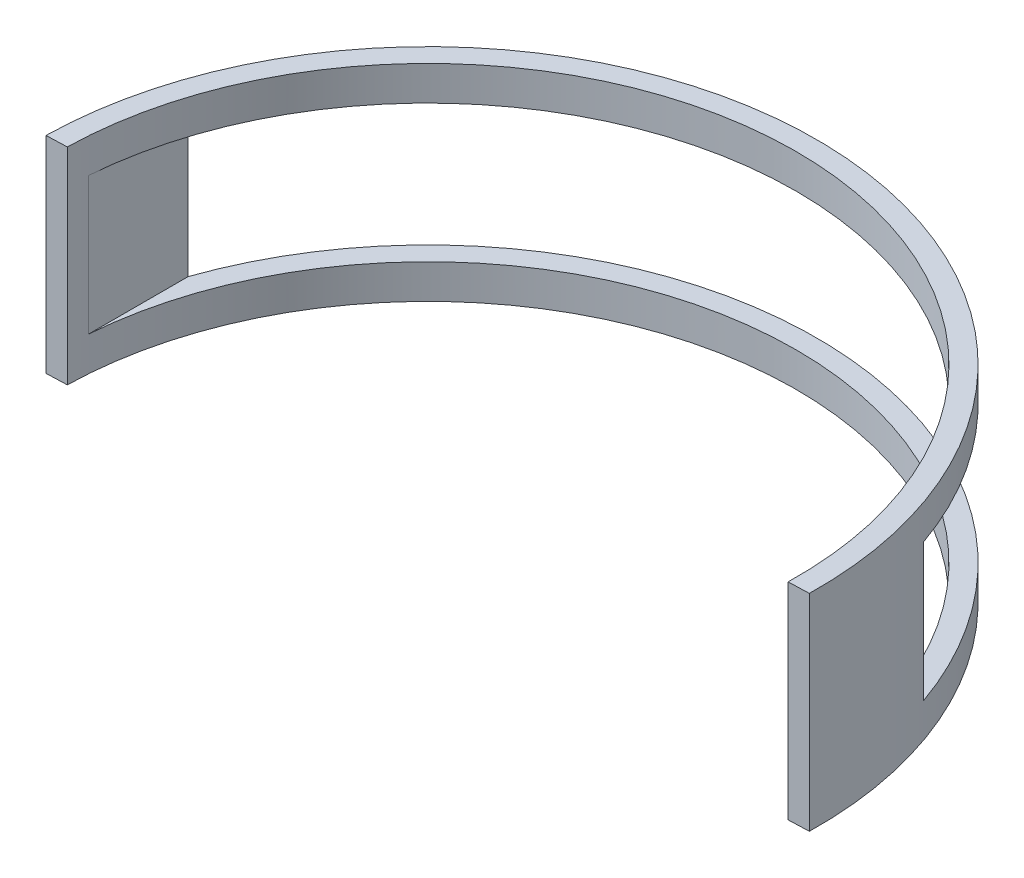
ISO-10303-21;
HEADER;
FILE_DESCRIPTION(('STEP AP214'),'2;1');
FILE_NAME('part.step','',(''),(''),'','','');
FILE_SCHEMA(('AUTOMOTIVE_DESIGN { 1 0 10303 214 1 1 1 1 }'));
ENDSEC;
DATA;
#1=APPLICATION_CONTEXT('core data for automotive mechanical design processes');
#2=APPLICATION_PROTOCOL_DEFINITION('international standard','automotive_design',2000,#1);
#3=PRODUCT_CONTEXT('',#1,'mechanical');
#4=PRODUCT('Part','Part','',(#3));
#5=PRODUCT_RELATED_PRODUCT_CATEGORY('part','',(#4));
#6=PRODUCT_DEFINITION_FORMATION('','',#4);
#7=PRODUCT_DEFINITION_CONTEXT('part definition',#1,'design');
#8=PRODUCT_DEFINITION('design','',#6,#7);
#9=PRODUCT_DEFINITION_SHAPE('','',#8);
#10=(LENGTH_UNIT() NAMED_UNIT(*) SI_UNIT(.MILLI.,.METRE.));
#11=(NAMED_UNIT(*) PLANE_ANGLE_UNIT() SI_UNIT($,.RADIAN.));
#12=(NAMED_UNIT(*) SI_UNIT($,.STERADIAN.) SOLID_ANGLE_UNIT());
#13=UNCERTAINTY_MEASURE_WITH_UNIT(LENGTH_MEASURE(1.E-05),#10,'distance_accuracy_value','');
#14=(GEOMETRIC_REPRESENTATION_CONTEXT(3) GLOBAL_UNCERTAINTY_ASSIGNED_CONTEXT((#13)) GLOBAL_UNIT_ASSIGNED_CONTEXT((#10,
#11,#12)) REPRESENTATION_CONTEXT('',''));
#15=CARTESIAN_POINT('',(0.,0.,0.));
#16=DIRECTION('',(0.,0.,1.));
#17=DIRECTION('',(1.,0.,0.));
#18=AXIS2_PLACEMENT_3D('',#15,#16,#17);
#19=CARTESIAN_POINT('',(0.,15.,0.));
#20=DIRECTION('',(0.,-1.,0.));
#21=DIRECTION('',(0.,0.,-1.));
#22=AXIS2_PLACEMENT_3D('',#19,#20,#21);
#23=CYLINDRICAL_SURFACE('',#22,56.6555359957958);
#24=CARTESIAN_POINT('',(0.,-15.,0.));
#25=DIRECTION('',(0.,1.,0.));
#26=DIRECTION('',(0.,0.,1.));
#27=AXIS2_PLACEMENT_3D('',#24,#25,#26);
#28=CIRCLE('',#27,56.6555359957958);
#29=CARTESIAN_POINT('',(56.6451469113242,-15.,1.0849379546368));
#30=VERTEX_POINT('',#29);
#31=CARTESIAN_POINT('',(-56.6451423998593,-15.,-1.08517347487532));
#32=VERTEX_POINT('',#31);
#33=EDGE_CURVE('E122',#30,#32,#28,.T.);
#34=ORIENTED_EDGE('',*,*,#33,.T.);
#35=DIRECTION('',(0.,-1.,0.));
#36=VECTOR('',#35,1.);
#37=CARTESIAN_POINT('',(-56.6451423998593,15.,-1.08517347487532));
#38=LINE('',#37,#36);
#39=CARTESIAN_POINT('',(-56.6451423998593,15.,-1.08517347487532));
#40=VERTEX_POINT('',#39);
#41=EDGE_CURVE('E149',#40,#32,#38,.T.);
#42=ORIENTED_EDGE('',*,*,#41,.F.);
#43=CARTESIAN_POINT('',(0.,15.,0.));
#44=DIRECTION('',(0.,1.,0.));
#45=DIRECTION('',(0.,0.,1.));
#46=AXIS2_PLACEMENT_3D('',#43,#44,#45);
#47=CIRCLE('',#46,56.6555359957958);
#48=CARTESIAN_POINT('',(56.6451469113242,15.,1.0849379546368));
#49=VERTEX_POINT('',#48);
#50=EDGE_CURVE('E123',#49,#40,#47,.T.);
#51=ORIENTED_EDGE('',*,*,#50,.F.);
#52=DIRECTION('',(0.,-1.,0.));
#53=VECTOR('',#52,1.);
#54=CARTESIAN_POINT('',(56.6451469113242,15.,1.0849379546368));
#55=LINE('',#54,#53);
#56=EDGE_CURVE('E133',#49,#30,#55,.T.);
#57=ORIENTED_EDGE('',*,*,#56,.T.);
#58=EDGE_LOOP('',(#34,#42,#51,#57));
#59=FACE_BOUND('',#58,.T.);
#60=DIRECTION('',(0.,-1.,0.));
#61=VECTOR('',#60,1.);
#62=CARTESIAN_POINT('',(53.5,15.,-18.6440274342994));
#63=LINE('',#62,#61);
#64=CARTESIAN_POINT('',(53.5,10.,-18.6440274342994));
#65=VERTEX_POINT('',#64);
#66=CARTESIAN_POINT('',(53.5,-10.,-18.6440274342994));
#67=VERTEX_POINT('',#66);
#68=EDGE_CURVE('E117',#65,#67,#63,.T.);
#69=ORIENTED_EDGE('',*,*,#68,.F.);
#70=CARTESIAN_POINT('',(0.,10.,0.));
#71=DIRECTION('',(0.,-1.,0.));
#72=DIRECTION('',(0.,0.,-1.));
#73=AXIS2_PLACEMENT_3D('',#70,#71,#72);
#74=CIRCLE('',#73,56.6555359957958);
#75=CARTESIAN_POINT('',(-53.5,10.,-18.6440274342995));
#76=VERTEX_POINT('',#75);
#77=EDGE_CURVE('E115',#76,#65,#74,.T.);
#78=ORIENTED_EDGE('',*,*,#77,.F.);
#79=DIRECTION('',(0.,-1.,0.));
#80=VECTOR('',#79,1.);
#81=CARTESIAN_POINT('',(-53.5,15.,-18.6440274342995));
#82=LINE('',#81,#80);
#83=CARTESIAN_POINT('',(-53.5,-10.,-18.6440274342995));
#84=VERTEX_POINT('',#83);
#85=EDGE_CURVE('E102',#84,#76,#82,.F.);
#86=ORIENTED_EDGE('',*,*,#85,.F.);
#87=CARTESIAN_POINT('',(0.,-10.,0.));
#88=DIRECTION('',(0.,1.,0.));
#89=DIRECTION('',(0.,0.,1.));
#90=AXIS2_PLACEMENT_3D('',#87,#88,#89);
#91=CIRCLE('',#90,56.6555359957958);
#92=EDGE_CURVE('E97',#67,#84,#91,.T.);
#93=ORIENTED_EDGE('',*,*,#92,.F.);
#94=EDGE_LOOP('',(#69,#78,#86,#93));
#95=FACE_BOUND('',#94,.T.);
#96=ADVANCED_FACE('F37',(#59,#95),#23,.T.);
#97=CARTESIAN_POINT('',(0.,15.,0.));
#98=DIRECTION('',(0.,-1.,0.));
#99=DIRECTION('',(0.,0.,-1.));
#100=AXIS2_PLACEMENT_3D('',#97,#98,#99);
#101=CYLINDRICAL_SURFACE('',#100,53.66);
#102=CARTESIAN_POINT('',(0.,-15.,0.));
#103=DIRECTION('',(0.,-1.,0.));
#104=DIRECTION('',(0.,0.,1.));
#105=AXIS2_PLACEMENT_3D('',#102,#103,#104);
#106=CIRCLE('',#105,53.66);
#107=CARTESIAN_POINT('',(-53.6468751630069,-15.,-1.18675407930591));
#108=VERTEX_POINT('',#107);
#109=CARTESIAN_POINT('',(53.6468751630069,-15.,1.18675407930591));
#110=VERTEX_POINT('',#109);
#111=EDGE_CURVE('E138',#108,#110,#106,.T.);
#112=ORIENTED_EDGE('',*,*,#111,.T.);
#113=DIRECTION('',(0.,-1.,0.));
#114=VECTOR('',#113,1.);
#115=CARTESIAN_POINT('',(53.6468751630069,15.,1.18675407930591));
#116=LINE('',#115,#114);
#117=CARTESIAN_POINT('',(53.6468751630069,15.,1.18675407930591));
#118=VERTEX_POINT('',#117);
#119=EDGE_CURVE('E143',#118,#110,#116,.T.);
#120=ORIENTED_EDGE('',*,*,#119,.F.);
#121=CARTESIAN_POINT('',(0.,15.,0.));
#122=DIRECTION('',(0.,-1.,0.));
#123=DIRECTION('',(0.,0.,1.));
#124=AXIS2_PLACEMENT_3D('',#121,#122,#123);
#125=CIRCLE('',#124,53.66);
#126=CARTESIAN_POINT('',(-53.6468751630069,15.,-1.18675407930591));
#127=VERTEX_POINT('',#126);
#128=EDGE_CURVE('E129',#127,#118,#125,.T.);
#129=ORIENTED_EDGE('',*,*,#128,.F.);
#130=DIRECTION('',(0.,-1.,0.));
#131=VECTOR('',#130,1.);
#132=CARTESIAN_POINT('',(-53.6468751630069,15.,-1.18675407930591));
#133=LINE('',#132,#131);
#134=EDGE_CURVE('E146',#127,#108,#133,.T.);
#135=ORIENTED_EDGE('',*,*,#134,.T.);
#136=EDGE_LOOP('',(#112,#120,#129,#135));
#137=FACE_BOUND('',#136,.T.);
#138=DIRECTION('',(0.,-1.,0.));
#139=VECTOR('',#138,1.);
#140=CARTESIAN_POINT('',(53.5,15.,-4.14072457427434));
#141=LINE('',#140,#139);
#142=CARTESIAN_POINT('',(53.5,-10.,-4.14072457427434));
#143=VERTEX_POINT('',#142);
#144=CARTESIAN_POINT('',(53.5,10.,-4.14072457427434));
#145=VERTEX_POINT('',#144);
#146=EDGE_CURVE('E11',#143,#145,#141,.F.);
#147=ORIENTED_EDGE('',*,*,#146,.F.);
#148=CARTESIAN_POINT('',(0.,-10.,0.));
#149=DIRECTION('',(0.,1.,0.));
#150=DIRECTION('',(0.,0.,1.));
#151=AXIS2_PLACEMENT_3D('',#148,#149,#150);
#152=CIRCLE('',#151,53.66);
#153=CARTESIAN_POINT('',(-53.5,-10.,-4.1407245742745));
#154=VERTEX_POINT('',#153);
#155=EDGE_CURVE('E152',#154,#143,#152,.F.);
#156=ORIENTED_EDGE('',*,*,#155,.F.);
#157=DIRECTION('',(0.,-1.,0.));
#158=VECTOR('',#157,1.);
#159=CARTESIAN_POINT('',(-53.5,15.,-4.1407245742745));
#160=LINE('',#159,#158);
#161=CARTESIAN_POINT('',(-53.5,10.,-4.1407245742745));
#162=VERTEX_POINT('',#161);
#163=EDGE_CURVE('E110',#162,#154,#160,.T.);
#164=ORIENTED_EDGE('',*,*,#163,.F.);
#165=CARTESIAN_POINT('',(0.,10.,0.));
#166=DIRECTION('',(0.,-1.,0.));
#167=DIRECTION('',(0.,0.,-1.));
#168=AXIS2_PLACEMENT_3D('',#165,#166,#167);
#169=CIRCLE('',#168,53.66);
#170=EDGE_CURVE('E44',#145,#162,#169,.F.);
#171=ORIENTED_EDGE('',*,*,#170,.F.);
#172=EDGE_LOOP('',(#147,#156,#164,#171));
#173=FACE_BOUND('',#172,.T.);
#174=ADVANCED_FACE('F162',(#137,#173),#101,.F.);
#175=CARTESIAN_POINT('',(-56.6451423998593,15.,-1.08517347487532));
#176=DIRECTION('',(-0.0338603424814454,0.,-0.999426574194943));
#177=DIRECTION('',(-0.999426574194943,0.,0.0338603424814454));
#178=AXIS2_PLACEMENT_3D('',#175,#176,#177);
#179=PLANE('',#178);
#180=DIRECTION('',(0.999426574194943,0.,-0.0338603424814454));
#181=VECTOR('',#180,1.);
#182=CARTESIAN_POINT('',(-56.6451423998593,-15.,-1.08517347487532));
#183=LINE('',#182,#181);
#184=EDGE_CURVE('E136',#32,#108,#183,.T.);
#185=ORIENTED_EDGE('',*,*,#184,.T.);
#186=ORIENTED_EDGE('',*,*,#134,.F.);
#187=DIRECTION('',(0.999426574194943,0.,-0.0338603424814454));
#188=VECTOR('',#187,1.);
#189=CARTESIAN_POINT('',(-56.6451423998593,15.,-1.08517347487532));
#190=LINE('',#189,#188);
#191=EDGE_CURVE('E126',#40,#127,#190,.T.);
#192=ORIENTED_EDGE('',*,*,#191,.F.);
#193=ORIENTED_EDGE('',*,*,#41,.T.);
#194=EDGE_LOOP('',(#185,#186,#192,#193));
#195=FACE_BOUND('',#194,.T.);
#196=ADVANCED_FACE('F183',(#195),#179,.F.);
#197=CARTESIAN_POINT('',(53.6468751630069,15.,1.18675407930591));
#198=DIRECTION('',(-0.0339387082230345,0.,-0.999423916105749));
#199=DIRECTION('',(-0.999423916105749,0.,0.0339387082230345));
#200=AXIS2_PLACEMENT_3D('',#197,#198,#199);
#201=PLANE('',#200);
#202=DIRECTION('',(0.999423916105749,0.,-0.0339387082230345));
#203=VECTOR('',#202,1.);
#204=CARTESIAN_POINT('',(53.6468751630069,-15.,1.18675407930591));
#205=LINE('',#204,#203);
#206=EDGE_CURVE('E127',#110,#30,#205,.T.);
#207=ORIENTED_EDGE('',*,*,#206,.T.);
#208=ORIENTED_EDGE('',*,*,#56,.F.);
#209=DIRECTION('',(0.999423916105749,0.,-0.0339387082230345));
#210=VECTOR('',#209,1.);
#211=CARTESIAN_POINT('',(53.6468751630069,15.,1.18675407930591));
#212=LINE('',#211,#210);
#213=EDGE_CURVE('E131',#118,#49,#212,.T.);
#214=ORIENTED_EDGE('',*,*,#213,.F.);
#215=ORIENTED_EDGE('',*,*,#119,.T.);
#216=EDGE_LOOP('',(#207,#208,#214,#215));
#217=FACE_BOUND('',#216,.T.);
#218=ADVANCED_FACE('F199',(#217),#201,.F.);
#219=CARTESIAN_POINT('',(0.,15.,0.));
#220=DIRECTION('',(0.,1.,0.));
#221=DIRECTION('',(0.,0.,1.));
#222=AXIS2_PLACEMENT_3D('',#219,#220,#221);
#223=PLANE('',#222);
#224=ORIENTED_EDGE('',*,*,#50,.T.);
#225=ORIENTED_EDGE('',*,*,#191,.T.);
#226=ORIENTED_EDGE('',*,*,#128,.T.);
#227=ORIENTED_EDGE('',*,*,#213,.T.);
#228=EDGE_LOOP('',(#224,#225,#226,#227));
#229=FACE_BOUND('',#228,.T.);
#230=ADVANCED_FACE('F174',(#229),#223,.T.);
#231=CARTESIAN_POINT('',(0.,-15.,0.));
#232=DIRECTION('',(0.,1.,0.));
#233=DIRECTION('',(0.,0.,1.));
#234=AXIS2_PLACEMENT_3D('',#231,#232,#233);
#235=PLANE('',#234);
#236=ORIENTED_EDGE('',*,*,#33,.F.);
#237=ORIENTED_EDGE('',*,*,#206,.F.);
#238=ORIENTED_EDGE('',*,*,#111,.F.);
#239=ORIENTED_EDGE('',*,*,#184,.F.);
#240=EDGE_LOOP('',(#236,#237,#238,#239));
#241=FACE_BOUND('',#240,.T.);
#242=ADVANCED_FACE('F167',(#241),#235,.F.);
#243=CARTESIAN_POINT('',(53.5,-10.,1.18675407930591));
#244=DIRECTION('',(-1.,0.,0.));
#245=DIRECTION('',(0.,0.,1.));
#246=AXIS2_PLACEMENT_3D('',#243,#244,#245);
#247=PLANE('',#246);
#248=ORIENTED_EDGE('',*,*,#68,.T.);
#249=DIRECTION('',(0.,0.,-1.));
#250=VECTOR('',#249,1.);
#251=CARTESIAN_POINT('',(53.5,-10.,1.18675407930591));
#252=LINE('',#251,#250);
#253=EDGE_CURVE('E51',#143,#67,#252,.T.);
#254=ORIENTED_EDGE('',*,*,#253,.F.);
#255=ORIENTED_EDGE('',*,*,#146,.T.);
#256=DIRECTION('',(0.,0.,-1.));
#257=VECTOR('',#256,1.);
#258=CARTESIAN_POINT('',(53.5,10.,1.18675407930591));
#259=LINE('',#258,#257);
#260=EDGE_CURVE('E103',#145,#65,#259,.T.);
#261=ORIENTED_EDGE('',*,*,#260,.T.);
#262=EDGE_LOOP('',(#248,#254,#255,#261));
#263=FACE_BOUND('',#262,.T.);
#264=ADVANCED_FACE('F164',(#263),#247,.T.);
#265=CARTESIAN_POINT('',(-53.5,10.,1.18675407930591));
#266=DIRECTION('',(0.,-1.,0.));
#267=DIRECTION('',(0.,0.,-1.));
#268=AXIS2_PLACEMENT_3D('',#265,#266,#267);
#269=PLANE('',#268);
#270=ORIENTED_EDGE('',*,*,#77,.T.);
#271=ORIENTED_EDGE('',*,*,#260,.F.);
#272=ORIENTED_EDGE('',*,*,#170,.T.);
#273=DIRECTION('',(0.,0.,-1.));
#274=VECTOR('',#273,1.);
#275=CARTESIAN_POINT('',(-53.5,10.,1.18675407930591));
#276=LINE('',#275,#274);
#277=EDGE_CURVE('E112',#162,#76,#276,.T.);
#278=ORIENTED_EDGE('',*,*,#277,.T.);
#279=EDGE_LOOP('',(#270,#271,#272,#278));
#280=FACE_BOUND('',#279,.T.);
#281=ADVANCED_FACE('F157',(#280),#269,.T.);
#282=CARTESIAN_POINT('',(-53.5,-10.,1.18675407930591));
#283=DIRECTION('',(1.,0.,0.));
#284=DIRECTION('',(0.,0.,-1.));
#285=AXIS2_PLACEMENT_3D('',#282,#283,#284);
#286=PLANE('',#285);
#287=ORIENTED_EDGE('',*,*,#85,.T.);
#288=ORIENTED_EDGE('',*,*,#277,.F.);
#289=ORIENTED_EDGE('',*,*,#163,.T.);
#290=DIRECTION('',(0.,0.,-1.));
#291=VECTOR('',#290,1.);
#292=CARTESIAN_POINT('',(-53.5,-10.,1.18675407930591));
#293=LINE('',#292,#291);
#294=EDGE_CURVE('E56',#154,#84,#293,.T.);
#295=ORIENTED_EDGE('',*,*,#294,.T.);
#296=EDGE_LOOP('',(#287,#288,#289,#295));
#297=FACE_BOUND('',#296,.T.);
#298=ADVANCED_FACE('F106',(#297),#286,.T.);
#299=CARTESIAN_POINT('',(-53.5,-10.,1.18675407930591));
#300=DIRECTION('',(0.,1.,0.));
#301=DIRECTION('',(0.,0.,1.));
#302=AXIS2_PLACEMENT_3D('',#299,#300,#301);
#303=PLANE('',#302);
#304=ORIENTED_EDGE('',*,*,#92,.T.);
#305=ORIENTED_EDGE('',*,*,#294,.F.);
#306=ORIENTED_EDGE('',*,*,#155,.T.);
#307=ORIENTED_EDGE('',*,*,#253,.T.);
#308=EDGE_LOOP('',(#304,#305,#306,#307));
#309=FACE_BOUND('',#308,.T.);
#310=ADVANCED_FACE('F98',(#309),#303,.T.);
#311=CLOSED_SHELL('',(#96,#174,#196,#218,#230,#242,#264,#281,#298,#310));
#312=MANIFOLD_SOLID_BREP('B2',#311);
#313=ADVANCED_BREP_SHAPE_REPRESENTATION('',(#18,#312),#14);
#314=SHAPE_DEFINITION_REPRESENTATION(#9,#313);
ENDSEC;
END-ISO-10303-21;
